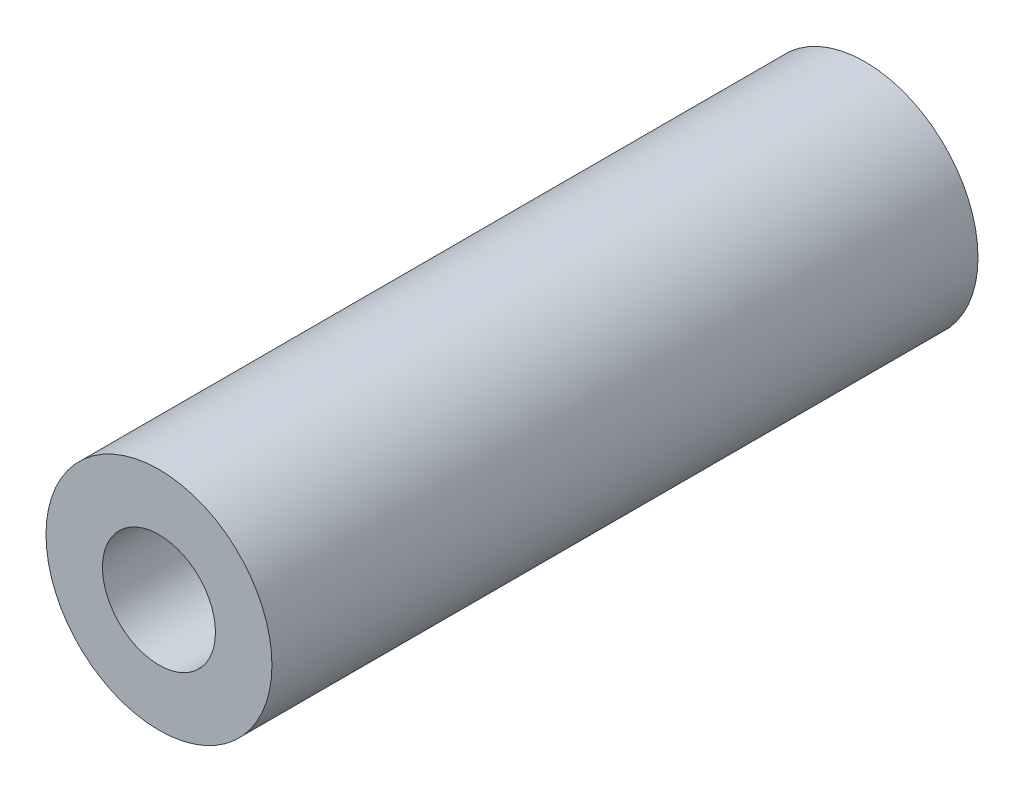
ISO-10303-21;
HEADER;
FILE_DESCRIPTION(('STEP AP214'),'2;1');
FILE_NAME('part.step','',(''),(''),'','','');
FILE_SCHEMA(('AUTOMOTIVE_DESIGN { 1 0 10303 214 1 1 1 1 }'));
ENDSEC;
DATA;
#1=APPLICATION_CONTEXT('core data for automotive mechanical design processes');
#2=APPLICATION_PROTOCOL_DEFINITION('international standard','automotive_design',2000,#1);
#3=PRODUCT_CONTEXT('',#1,'mechanical');
#4=PRODUCT('Part','Part','',(#3));
#5=PRODUCT_RELATED_PRODUCT_CATEGORY('part','',(#4));
#6=PRODUCT_DEFINITION_FORMATION('','',#4);
#7=PRODUCT_DEFINITION_CONTEXT('part definition',#1,'design');
#8=PRODUCT_DEFINITION('design','',#6,#7);
#9=PRODUCT_DEFINITION_SHAPE('','',#8);
#10=(LENGTH_UNIT() NAMED_UNIT(*) SI_UNIT(.MILLI.,.METRE.));
#11=(NAMED_UNIT(*) PLANE_ANGLE_UNIT() SI_UNIT($,.RADIAN.));
#12=(NAMED_UNIT(*) SI_UNIT($,.STERADIAN.) SOLID_ANGLE_UNIT());
#13=UNCERTAINTY_MEASURE_WITH_UNIT(LENGTH_MEASURE(1.E-05),#10,'distance_accuracy_value','');
#14=(GEOMETRIC_REPRESENTATION_CONTEXT(3) GLOBAL_UNCERTAINTY_ASSIGNED_CONTEXT((#13)) GLOBAL_UNIT_ASSIGNED_CONTEXT((#10,
#11,#12)) REPRESENTATION_CONTEXT('',''));
#15=CARTESIAN_POINT('',(0.,0.,0.));
#16=DIRECTION('',(0.,0.,1.));
#17=DIRECTION('',(1.,0.,0.));
#18=AXIS2_PLACEMENT_3D('',#15,#16,#17);
#19=CARTESIAN_POINT('',(0.,0.,12.5));
#20=DIRECTION('',(0.,0.,1.));
#21=DIRECTION('',(1.,0.,0.));
#22=AXIS2_PLACEMENT_3D('',#19,#20,#21);
#23=PLANE('',#22);
#24=CARTESIAN_POINT('',(0.,0.,12.5));
#25=DIRECTION('',(0.,0.,1.));
#26=DIRECTION('',(1.,0.,0.));
#27=AXIS2_PLACEMENT_3D('',#24,#25,#26);
#28=CIRCLE('',#27,4.);
#29=CARTESIAN_POINT('',(4.,0.,12.5));
#30=VERTEX_POINT('',#29);
#31=EDGE_CURVE('E10',#30,#30,#28,.T.);
#32=ORIENTED_EDGE('',*,*,#31,.T.);
#33=EDGE_LOOP('',(#32));
#34=FACE_BOUND('',#33,.T.);
#35=CARTESIAN_POINT('',(0.,0.,12.5));
#36=DIRECTION('',(0.,0.,1.));
#37=DIRECTION('',(1.,0.,0.));
#38=AXIS2_PLACEMENT_3D('',#35,#36,#37);
#39=CIRCLE('',#38,2.);
#40=CARTESIAN_POINT('',(2.,0.,12.5));
#41=VERTEX_POINT('',#40);
#42=EDGE_CURVE('E42',#41,#41,#39,.T.);
#43=ORIENTED_EDGE('',*,*,#42,.F.);
#44=EDGE_LOOP('',(#43));
#45=FACE_BOUND('',#44,.T.);
#46=ADVANCED_FACE('F31',(#34,#45),#23,.T.);
#47=CARTESIAN_POINT('',(0.,0.,-12.5));
#48=DIRECTION('',(0.,0.,1.));
#49=DIRECTION('',(1.,0.,0.));
#50=AXIS2_PLACEMENT_3D('',#47,#48,#49);
#51=PLANE('',#50);
#52=CARTESIAN_POINT('',(0.,0.,-12.5));
#53=DIRECTION('',(0.,0.,1.));
#54=DIRECTION('',(1.,0.,0.));
#55=AXIS2_PLACEMENT_3D('',#52,#53,#54);
#56=CIRCLE('',#55,4.);
#57=CARTESIAN_POINT('',(4.,0.,-12.5));
#58=VERTEX_POINT('',#57);
#59=EDGE_CURVE('E35',#58,#58,#56,.T.);
#60=ORIENTED_EDGE('',*,*,#59,.F.);
#61=EDGE_LOOP('',(#60));
#62=FACE_BOUND('',#61,.T.);
#63=CARTESIAN_POINT('',(0.,0.,-12.5));
#64=DIRECTION('',(0.,0.,1.));
#65=DIRECTION('',(1.,0.,0.));
#66=AXIS2_PLACEMENT_3D('',#63,#64,#65);
#67=CIRCLE('',#66,2.);
#68=CARTESIAN_POINT('',(2.,0.,-12.5));
#69=VERTEX_POINT('',#68);
#70=EDGE_CURVE('E44',#69,#69,#67,.T.);
#71=ORIENTED_EDGE('',*,*,#70,.T.);
#72=EDGE_LOOP('',(#71));
#73=FACE_BOUND('',#72,.T.);
#74=ADVANCED_FACE('F54',(#62,#73),#51,.F.);
#75=CARTESIAN_POINT('',(0.,0.,12.5));
#76=DIRECTION('',(0.,0.,-1.));
#77=DIRECTION('',(-1.,0.,0.));
#78=AXIS2_PLACEMENT_3D('',#75,#76,#77);
#79=CYLINDRICAL_SURFACE('',#78,4.);
#80=ORIENTED_EDGE('',*,*,#31,.F.);
#81=EDGE_LOOP('',(#80));
#82=FACE_BOUND('',#81,.T.);
#83=ORIENTED_EDGE('',*,*,#59,.T.);
#84=EDGE_LOOP('',(#83));
#85=FACE_BOUND('',#84,.T.);
#86=ADVANCED_FACE('F33',(#82,#85),#79,.T.);
#87=CARTESIAN_POINT('',(0.,0.,12.5));
#88=DIRECTION('',(0.,0.,-1.));
#89=DIRECTION('',(-1.,0.,0.));
#90=AXIS2_PLACEMENT_3D('',#87,#88,#89);
#91=CYLINDRICAL_SURFACE('',#90,2.);
#92=ORIENTED_EDGE('',*,*,#42,.T.);
#93=EDGE_LOOP('',(#92));
#94=FACE_BOUND('',#93,.T.);
#95=ORIENTED_EDGE('',*,*,#70,.F.);
#96=EDGE_LOOP('',(#95));
#97=FACE_BOUND('',#96,.T.);
#98=ADVANCED_FACE('F50',(#94,#97),#91,.F.);
#99=CLOSED_SHELL('',(#46,#74,#86,#98));
#100=MANIFOLD_SOLID_BREP('B2',#99);
#101=ADVANCED_BREP_SHAPE_REPRESENTATION('',(#18,#100),#14);
#102=SHAPE_DEFINITION_REPRESENTATION(#9,#101);
ENDSEC;
END-ISO-10303-21;
